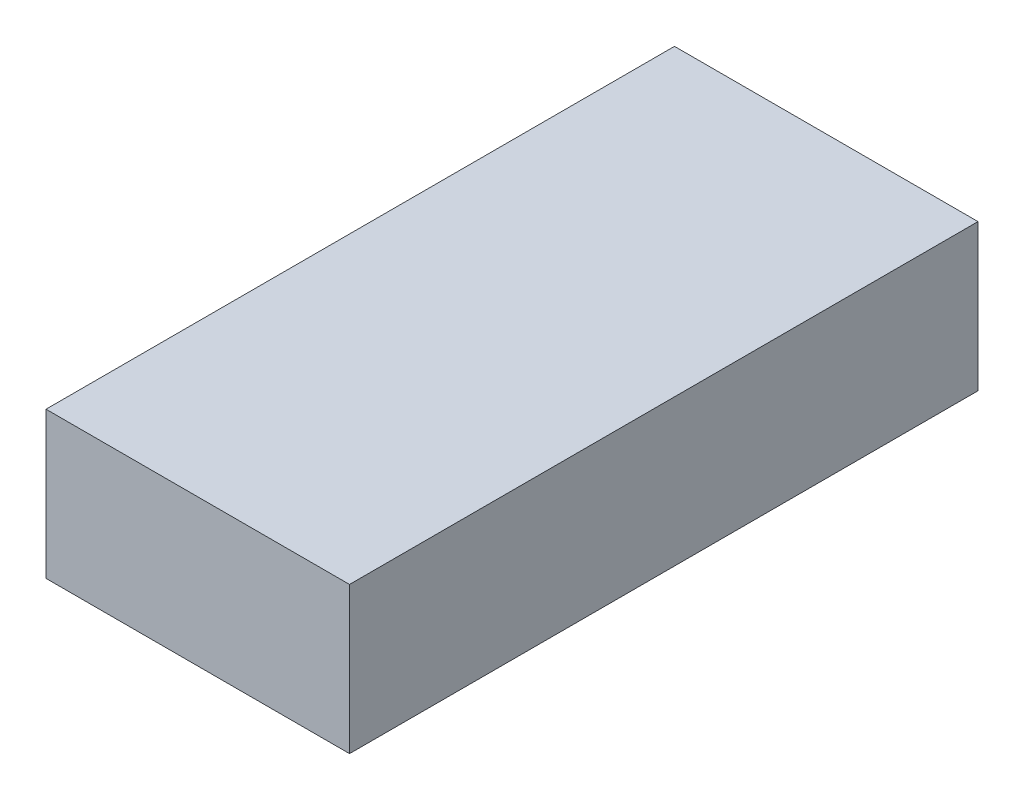
ISO-10303-21;
HEADER;
FILE_DESCRIPTION(('STEP AP214'),'2;1');
FILE_NAME('part.step','',(''),(''),'','','');
FILE_SCHEMA(('AUTOMOTIVE_DESIGN { 1 0 10303 214 1 1 1 1 }'));
ENDSEC;
DATA;
#1=APPLICATION_CONTEXT('core data for automotive mechanical design processes');
#2=APPLICATION_PROTOCOL_DEFINITION('international standard','automotive_design',2000,#1);
#3=PRODUCT_CONTEXT('',#1,'mechanical');
#4=PRODUCT('Part','Part','',(#3));
#5=PRODUCT_RELATED_PRODUCT_CATEGORY('part','',(#4));
#6=PRODUCT_DEFINITION_FORMATION('','',#4);
#7=PRODUCT_DEFINITION_CONTEXT('part definition',#1,'design');
#8=PRODUCT_DEFINITION('design','',#6,#7);
#9=PRODUCT_DEFINITION_SHAPE('','',#8);
#10=(LENGTH_UNIT() NAMED_UNIT(*) SI_UNIT(.MILLI.,.METRE.));
#11=(NAMED_UNIT(*) PLANE_ANGLE_UNIT() SI_UNIT($,.RADIAN.));
#12=(NAMED_UNIT(*) SI_UNIT($,.STERADIAN.) SOLID_ANGLE_UNIT());
#13=UNCERTAINTY_MEASURE_WITH_UNIT(LENGTH_MEASURE(1.E-05),#10,'distance_accuracy_value','');
#14=(GEOMETRIC_REPRESENTATION_CONTEXT(3) GLOBAL_UNCERTAINTY_ASSIGNED_CONTEXT((#13)) GLOBAL_UNIT_ASSIGNED_CONTEXT((#10,
#11,#12)) REPRESENTATION_CONTEXT('',''));
#15=CARTESIAN_POINT('',(0.,0.,0.));
#16=DIRECTION('',(0.,0.,1.));
#17=DIRECTION('',(1.,0.,0.));
#18=AXIS2_PLACEMENT_3D('',#15,#16,#17);
#19=CARTESIAN_POINT('',(0.,0.,108.5));
#20=DIRECTION('',(1.,0.,0.));
#21=DIRECTION('',(0.,0.,-1.));
#22=AXIS2_PLACEMENT_3D('',#19,#20,#21);
#23=PLANE('',#22);
#24=DIRECTION('',(0.,-1.,0.));
#25=VECTOR('',#24,1.);
#26=CARTESIAN_POINT('',(0.,0.,0.));
#27=LINE('',#26,#25);
#28=CARTESIAN_POINT('',(0.,25.3,0.));
#29=VERTEX_POINT('',#28);
#30=CARTESIAN_POINT('',(0.,0.,0.));
#31=VERTEX_POINT('',#30);
#32=EDGE_CURVE('E96',#29,#31,#27,.T.);
#33=ORIENTED_EDGE('',*,*,#32,.T.);
#34=DIRECTION('',(0.,0.,-1.));
#35=VECTOR('',#34,1.);
#36=CARTESIAN_POINT('',(0.,0.,108.5));
#37=LINE('',#36,#35);
#38=CARTESIAN_POINT('',(0.,0.,108.5));
#39=VERTEX_POINT('',#38);
#40=EDGE_CURVE('E11',#39,#31,#37,.T.);
#41=ORIENTED_EDGE('',*,*,#40,.F.);
#42=DIRECTION('',(0.,-1.,0.));
#43=VECTOR('',#42,1.);
#44=CARTESIAN_POINT('',(0.,0.,108.5));
#45=LINE('',#44,#43);
#46=CARTESIAN_POINT('',(0.,25.3,108.5));
#47=VERTEX_POINT('',#46);
#48=EDGE_CURVE('E84',#47,#39,#45,.T.);
#49=ORIENTED_EDGE('',*,*,#48,.F.);
#50=DIRECTION('',(0.,0.,-1.));
#51=VECTOR('',#50,1.);
#52=CARTESIAN_POINT('',(0.,25.3,108.5));
#53=LINE('',#52,#51);
#54=EDGE_CURVE('E92',#47,#29,#53,.T.);
#55=ORIENTED_EDGE('',*,*,#54,.T.);
#56=EDGE_LOOP('',(#33,#41,#49,#55));
#57=FACE_BOUND('',#56,.T.);
#58=ADVANCED_FACE('F33',(#57),#23,.F.);
#59=CARTESIAN_POINT('',(0.,0.,108.5));
#60=DIRECTION('',(0.,1.,0.));
#61=DIRECTION('',(0.,0.,1.));
#62=AXIS2_PLACEMENT_3D('',#59,#60,#61);
#63=PLANE('',#62);
#64=DIRECTION('',(1.,0.,0.));
#65=VECTOR('',#64,1.);
#66=CARTESIAN_POINT('',(0.,0.,0.));
#67=LINE('',#66,#65);
#68=CARTESIAN_POINT('',(52.4,0.,0.));
#69=VERTEX_POINT('',#68);
#70=EDGE_CURVE('E88',#31,#69,#67,.T.);
#71=ORIENTED_EDGE('',*,*,#70,.T.);
#72=DIRECTION('',(0.,0.,-1.));
#73=VECTOR('',#72,1.);
#74=CARTESIAN_POINT('',(52.4,0.,108.5));
#75=LINE('',#74,#73);
#76=CARTESIAN_POINT('',(52.4,0.,108.5));
#77=VERTEX_POINT('',#76);
#78=EDGE_CURVE('E41',#77,#69,#75,.T.);
#79=ORIENTED_EDGE('',*,*,#78,.F.);
#80=DIRECTION('',(1.,0.,0.));
#81=VECTOR('',#80,1.);
#82=CARTESIAN_POINT('',(0.,0.,108.5));
#83=LINE('',#82,#81);
#84=EDGE_CURVE('E79',#39,#77,#83,.T.);
#85=ORIENTED_EDGE('',*,*,#84,.F.);
#86=ORIENTED_EDGE('',*,*,#40,.T.);
#87=EDGE_LOOP('',(#71,#79,#85,#86));
#88=FACE_BOUND('',#87,.T.);
#89=ADVANCED_FACE('F87',(#88),#63,.F.);
#90=CARTESIAN_POINT('',(52.4,0.,108.5));
#91=DIRECTION('',(-1.,0.,0.));
#92=DIRECTION('',(0.,0.,1.));
#93=AXIS2_PLACEMENT_3D('',#90,#91,#92);
#94=PLANE('',#93);
#95=DIRECTION('',(0.,1.,0.));
#96=VECTOR('',#95,1.);
#97=CARTESIAN_POINT('',(52.4,0.,0.));
#98=LINE('',#97,#96);
#99=CARTESIAN_POINT('',(52.4,25.3,0.));
#100=VERTEX_POINT('',#99);
#101=EDGE_CURVE('E66',#69,#100,#98,.T.);
#102=ORIENTED_EDGE('',*,*,#101,.T.);
#103=DIRECTION('',(0.,0.,-1.));
#104=VECTOR('',#103,1.);
#105=CARTESIAN_POINT('',(52.4,25.3,108.5));
#106=LINE('',#105,#104);
#107=CARTESIAN_POINT('',(52.4,25.3,108.5));
#108=VERTEX_POINT('',#107);
#109=EDGE_CURVE('E89',#108,#100,#106,.T.);
#110=ORIENTED_EDGE('',*,*,#109,.F.);
#111=DIRECTION('',(0.,1.,0.));
#112=VECTOR('',#111,1.);
#113=CARTESIAN_POINT('',(52.4,0.,108.5));
#114=LINE('',#113,#112);
#115=EDGE_CURVE('E82',#77,#108,#114,.T.);
#116=ORIENTED_EDGE('',*,*,#115,.F.);
#117=ORIENTED_EDGE('',*,*,#78,.T.);
#118=EDGE_LOOP('',(#102,#110,#116,#117));
#119=FACE_BOUND('',#118,.T.);
#120=ADVANCED_FACE('F90',(#119),#94,.F.);
#121=CARTESIAN_POINT('',(0.,25.3,108.5));
#122=DIRECTION('',(0.,-1.,0.));
#123=DIRECTION('',(0.,0.,-1.));
#124=AXIS2_PLACEMENT_3D('',#121,#122,#123);
#125=PLANE('',#124);
#126=DIRECTION('',(-1.,0.,0.));
#127=VECTOR('',#126,1.);
#128=CARTESIAN_POINT('',(0.,25.3,0.));
#129=LINE('',#128,#127);
#130=EDGE_CURVE('E72',#100,#29,#129,.T.);
#131=ORIENTED_EDGE('',*,*,#130,.T.);
#132=ORIENTED_EDGE('',*,*,#54,.F.);
#133=DIRECTION('',(-1.,0.,0.));
#134=VECTOR('',#133,1.);
#135=CARTESIAN_POINT('',(0.,25.3,108.5));
#136=LINE('',#135,#134);
#137=EDGE_CURVE('E49',#108,#47,#136,.T.);
#138=ORIENTED_EDGE('',*,*,#137,.F.);
#139=ORIENTED_EDGE('',*,*,#109,.T.);
#140=EDGE_LOOP('',(#131,#132,#138,#139));
#141=FACE_BOUND('',#140,.T.);
#142=ADVANCED_FACE('F103',(#141),#125,.F.);
#143=CARTESIAN_POINT('',(0.,0.,108.5));
#144=DIRECTION('',(0.,0.,-1.));
#145=DIRECTION('',(-1.,0.,0.));
#146=AXIS2_PLACEMENT_3D('',#143,#144,#145);
#147=PLANE('',#146);
#148=ORIENTED_EDGE('',*,*,#48,.T.);
#149=ORIENTED_EDGE('',*,*,#84,.T.);
#150=ORIENTED_EDGE('',*,*,#115,.T.);
#151=ORIENTED_EDGE('',*,*,#137,.T.);
#152=EDGE_LOOP('',(#148,#149,#150,#151));
#153=FACE_BOUND('',#152,.T.);
#154=ADVANCED_FACE('F80',(#153),#147,.F.);
#155=CARTESIAN_POINT('',(0.,0.,0.));
#156=DIRECTION('',(0.,0.,-1.));
#157=DIRECTION('',(-1.,0.,0.));
#158=AXIS2_PLACEMENT_3D('',#155,#156,#157);
#159=PLANE('',#158);
#160=ORIENTED_EDGE('',*,*,#32,.F.);
#161=ORIENTED_EDGE('',*,*,#130,.F.);
#162=ORIENTED_EDGE('',*,*,#101,.F.);
#163=ORIENTED_EDGE('',*,*,#70,.F.);
#164=EDGE_LOOP('',(#160,#161,#162,#163));
#165=FACE_BOUND('',#164,.T.);
#166=ADVANCED_FACE('F106',(#165),#159,.T.);
#167=CLOSED_SHELL('',(#58,#89,#120,#142,#154,#166));
#168=MANIFOLD_SOLID_BREP('B2',#167);
#169=ADVANCED_BREP_SHAPE_REPRESENTATION('',(#18,#168),#14);
#170=SHAPE_DEFINITION_REPRESENTATION(#9,#169);
ENDSEC;
END-ISO-10303-21;
